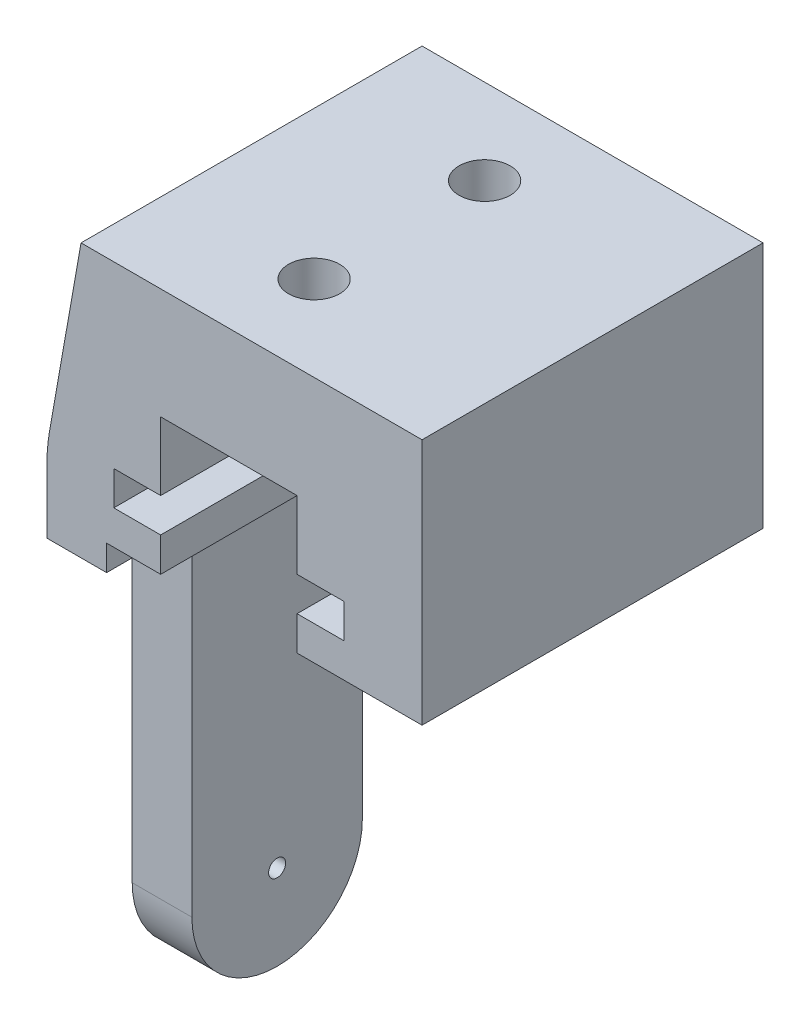
ISO-10303-21;
HEADER;
FILE_DESCRIPTION(('STEP AP214'),'2;1');
FILE_NAME('part.step','',(''),(''),'','','');
FILE_SCHEMA(('AUTOMOTIVE_DESIGN { 1 0 10303 214 1 1 1 1 }'));
ENDSEC;
DATA;
#1=APPLICATION_CONTEXT('core data for automotive mechanical design processes');
#2=APPLICATION_PROTOCOL_DEFINITION('international standard','automotive_design',2000,#1);
#3=PRODUCT_CONTEXT('',#1,'mechanical');
#4=PRODUCT('Part','Part','',(#3));
#5=PRODUCT_RELATED_PRODUCT_CATEGORY('part','',(#4));
#6=PRODUCT_DEFINITION_FORMATION('','',#4);
#7=PRODUCT_DEFINITION_CONTEXT('part definition',#1,'design');
#8=PRODUCT_DEFINITION('design','',#6,#7);
#9=PRODUCT_DEFINITION_SHAPE('','',#8);
#10=(LENGTH_UNIT() NAMED_UNIT(*) SI_UNIT(.MILLI.,.METRE.));
#11=(NAMED_UNIT(*) PLANE_ANGLE_UNIT() SI_UNIT($,.RADIAN.));
#12=(NAMED_UNIT(*) SI_UNIT($,.STERADIAN.) SOLID_ANGLE_UNIT());
#13=UNCERTAINTY_MEASURE_WITH_UNIT(LENGTH_MEASURE(1.E-05),#10,'distance_accuracy_value','');
#14=(GEOMETRIC_REPRESENTATION_CONTEXT(3) GLOBAL_UNCERTAINTY_ASSIGNED_CONTEXT((#13)) GLOBAL_UNIT_ASSIGNED_CONTEXT((#10,
#11,#12)) REPRESENTATION_CONTEXT('',''));
#15=CARTESIAN_POINT('',(0.,0.,0.));
#16=DIRECTION('',(0.,0.,1.));
#17=DIRECTION('',(1.,0.,0.));
#18=AXIS2_PLACEMENT_3D('',#15,#16,#17);
#19=CARTESIAN_POINT('',(0.,-16.,20.));
#20=DIRECTION('',(0.,1.,0.));
#21=DIRECTION('',(0.,0.,1.));
#22=AXIS2_PLACEMENT_3D('',#19,#20,#21);
#23=PLANE('',#22);
#24=DIRECTION('',(0.,0.,-1.));
#25=VECTOR('',#24,1.);
#26=CARTESIAN_POINT('',(0.,-16.,20.));
#27=LINE('',#26,#25);
#28=CARTESIAN_POINT('',(0.,-16.,20.));
#29=VERTEX_POINT('',#28);
#30=CARTESIAN_POINT('',(0.,-16.,16.));
#31=VERTEX_POINT('',#30);
#32=EDGE_CURVE('E348',#29,#31,#27,.T.);
#33=ORIENTED_EDGE('',*,*,#32,.T.);
#34=DIRECTION('',(-1.,0.,0.));
#35=VECTOR('',#34,1.);
#36=CARTESIAN_POINT('',(3.5,-16.,16.));
#37=LINE('',#36,#35);
#38=CARTESIAN_POINT('',(3.5,-16.,16.));
#39=VERTEX_POINT('',#38);
#40=EDGE_CURVE('E55',#31,#39,#37,.F.);
#41=ORIENTED_EDGE('',*,*,#40,.T.);
#42=DIRECTION('',(0.,0.,1.));
#43=VECTOR('',#42,1.);
#44=CARTESIAN_POINT('',(3.5,-16.,-20.7966343430854));
#45=LINE('',#44,#43);
#46=CARTESIAN_POINT('',(3.5,-16.,20.));
#47=VERTEX_POINT('',#46);
#48=EDGE_CURVE('E332',#39,#47,#45,.T.);
#49=ORIENTED_EDGE('',*,*,#48,.T.);
#50=DIRECTION('',(1.,0.,0.));
#51=VECTOR('',#50,1.);
#52=CARTESIAN_POINT('',(0.,-16.,20.));
#53=LINE('',#52,#51);
#54=EDGE_CURVE('E455',#29,#47,#53,.T.);
#55=ORIENTED_EDGE('',*,*,#54,.F.);
#56=EDGE_LOOP('',(#33,#41,#49,#55));
#57=FACE_BOUND('',#56,.T.);
#58=ADVANCED_FACE('F34',(#57),#23,.F.);
#59=CARTESIAN_POINT('',(3.5,-16.,0.));
#60=VERTEX_POINT('',#59);
#61=CARTESIAN_POINT('',(3.5,-16.,4.));
#62=VERTEX_POINT('',#61);
#63=EDGE_CURVE('E342',#60,#62,#45,.T.);
#64=ORIENTED_EDGE('',*,*,#63,.T.);
#65=DIRECTION('',(1.,0.,0.));
#66=VECTOR('',#65,1.);
#67=CARTESIAN_POINT('',(0.,-16.,4.));
#68=LINE('',#67,#66);
#69=CARTESIAN_POINT('',(0.,-16.,4.));
#70=VERTEX_POINT('',#69);
#71=EDGE_CURVE('E364',#62,#70,#68,.F.);
#72=ORIENTED_EDGE('',*,*,#71,.T.);
#73=CARTESIAN_POINT('',(0.,-16.,0.));
#74=VERTEX_POINT('',#73);
#75=EDGE_CURVE('E351',#70,#74,#27,.T.);
#76=ORIENTED_EDGE('',*,*,#75,.T.);
#77=DIRECTION('',(1.,0.,0.));
#78=VECTOR('',#77,1.);
#79=CARTESIAN_POINT('',(0.,-16.,0.));
#80=LINE('',#79,#78);
#81=EDGE_CURVE('E422',#74,#60,#80,.T.);
#82=ORIENTED_EDGE('',*,*,#81,.T.);
#83=EDGE_LOOP('',(#64,#72,#76,#82));
#84=FACE_BOUND('',#83,.T.);
#85=ADVANCED_FACE('F506',(#84),#23,.F.);
#86=CARTESIAN_POINT('',(22.,0.,20.));
#87=DIRECTION('',(-1.,0.,0.));
#88=DIRECTION('',(0.,-1.,0.));
#89=AXIS2_PLACEMENT_3D('',#86,#87,#88);
#90=PLANE('',#89);
#91=DIRECTION('',(0.,0.,1.));
#92=VECTOR('',#91,1.);
#93=CARTESIAN_POINT('',(22.,-14.5,-20.7966343430854));
#94=LINE('',#93,#92);
#95=CARTESIAN_POINT('',(22.,-14.5,0.));
#96=VERTEX_POINT('',#95);
#97=CARTESIAN_POINT('',(22.,-14.5,20.));
#98=VERTEX_POINT('',#97);
#99=EDGE_CURVE('E335',#96,#98,#94,.T.);
#100=ORIENTED_EDGE('',*,*,#99,.F.);
#101=DIRECTION('',(0.,1.,0.));
#102=VECTOR('',#101,1.);
#103=CARTESIAN_POINT('',(22.,0.,0.));
#104=LINE('',#103,#102);
#105=CARTESIAN_POINT('',(22.,0.,0.));
#106=VERTEX_POINT('',#105);
#107=EDGE_CURVE('E413',#96,#106,#104,.T.);
#108=ORIENTED_EDGE('',*,*,#107,.T.);
#109=DIRECTION('',(0.,0.,-1.));
#110=VECTOR('',#109,1.);
#111=CARTESIAN_POINT('',(22.,0.,20.));
#112=LINE('',#111,#110);
#113=CARTESIAN_POINT('',(22.,0.,20.));
#114=VERTEX_POINT('',#113);
#115=EDGE_CURVE('E356',#114,#106,#112,.T.);
#116=ORIENTED_EDGE('',*,*,#115,.F.);
#117=DIRECTION('',(0.,1.,0.));
#118=VECTOR('',#117,1.);
#119=CARTESIAN_POINT('',(22.,0.,20.));
#120=LINE('',#119,#118);
#121=EDGE_CURVE('E457',#98,#114,#120,.T.);
#122=ORIENTED_EDGE('',*,*,#121,.F.);
#123=EDGE_LOOP('',(#100,#108,#116,#122));
#124=FACE_BOUND('',#123,.T.);
#125=ADVANCED_FACE('F430',(#124),#90,.F.);
#126=CARTESIAN_POINT('',(0.,0.,20.));
#127=DIRECTION('',(0.,0.,1.));
#128=DIRECTION('',(1.,0.,0.));
#129=AXIS2_PLACEMENT_3D('',#126,#127,#128);
#130=PLANE('',#129);
#131=DIRECTION('',(0.173648177666931,0.984807753012208,0.));
#132=VECTOR('',#131,1.);
#133=CARTESIAN_POINT('',(1.93969262078591,-0.34202014332567,20.));
#134=LINE('',#133,#132);
#135=CARTESIAN_POINT('',(2.,0.,20.));
#136=VERTEX_POINT('',#135);
#137=CARTESIAN_POINT('',(0.151922469877919,-10.4809684978253,20.));
#138=VERTEX_POINT('',#137);
#139=EDGE_CURVE('E396',#136,#138,#134,.F.);
#140=ORIENTED_EDGE('',*,*,#139,.T.);
#141=CARTESIAN_POINT('',(10.,-12.2174502744946,20.));
#142=DIRECTION('',(0.,0.,1.));
#143=DIRECTION('',(1.,0.,0.));
#144=AXIS2_PLACEMENT_3D('',#141,#142,#143);
#145=CIRCLE('',#144,10.);
#146=CARTESIAN_POINT('',(0.,-12.2174502744946,20.));
#147=VERTEX_POINT('',#146);
#148=EDGE_CURVE('E346',#138,#147,#145,.T.);
#149=ORIENTED_EDGE('',*,*,#148,.T.);
#150=DIRECTION('',(0.,-1.,0.));
#151=VECTOR('',#150,1.);
#152=CARTESIAN_POINT('',(0.,0.,20.));
#153=LINE('',#152,#151);
#154=EDGE_CURVE('E412',#147,#29,#153,.T.);
#155=ORIENTED_EDGE('',*,*,#154,.T.);
#156=ORIENTED_EDGE('',*,*,#54,.T.);
#157=DIRECTION('',(0.,1.,0.));
#158=VECTOR('',#157,1.);
#159=CARTESIAN_POINT('',(3.5,-16.,20.));
#160=LINE('',#159,#158);
#161=CARTESIAN_POINT('',(3.5,-14.5,20.));
#162=VERTEX_POINT('',#161);
#163=EDGE_CURVE('E302',#47,#162,#160,.T.);
#164=ORIENTED_EDGE('',*,*,#163,.T.);
#165=DIRECTION('',(1.,0.,0.));
#166=VECTOR('',#165,1.);
#167=CARTESIAN_POINT('',(3.5,-14.5,20.));
#168=LINE('',#167,#166);
#169=CARTESIAN_POINT('',(6.67,-14.5,20.));
#170=VERTEX_POINT('',#169);
#171=EDGE_CURVE('E305',#162,#170,#168,.T.);
#172=ORIENTED_EDGE('',*,*,#171,.T.);
#173=DIRECTION('',(0.,1.,0.));
#174=VECTOR('',#173,1.);
#175=CARTESIAN_POINT('',(6.67,-14.5,20.));
#176=LINE('',#175,#174);
#177=CARTESIAN_POINT('',(6.67,-12.5,20.));
#178=VERTEX_POINT('',#177);
#179=EDGE_CURVE('E308',#170,#178,#176,.T.);
#180=ORIENTED_EDGE('',*,*,#179,.T.);
#181=DIRECTION('',(-1.,0.,0.));
#182=VECTOR('',#181,1.);
#183=CARTESIAN_POINT('',(6.67,-12.5,20.));
#184=LINE('',#183,#182);
#185=CARTESIAN_POINT('',(3.92,-12.5,20.));
#186=VERTEX_POINT('',#185);
#187=EDGE_CURVE('E311',#178,#186,#184,.T.);
#188=ORIENTED_EDGE('',*,*,#187,.T.);
#189=DIRECTION('',(0.,1.,0.));
#190=VECTOR('',#189,1.);
#191=CARTESIAN_POINT('',(3.92,-12.5,20.));
#192=LINE('',#191,#190);
#193=CARTESIAN_POINT('',(3.92,-10.5,20.));
#194=VERTEX_POINT('',#193);
#195=EDGE_CURVE('E314',#186,#194,#192,.T.);
#196=ORIENTED_EDGE('',*,*,#195,.T.);
#197=DIRECTION('',(1.,0.,0.));
#198=VECTOR('',#197,1.);
#199=CARTESIAN_POINT('',(3.92,-10.5,20.));
#200=LINE('',#199,#198);
#201=CARTESIAN_POINT('',(6.67,-10.5,20.));
#202=VERTEX_POINT('',#201);
#203=EDGE_CURVE('E317',#194,#202,#200,.T.);
#204=ORIENTED_EDGE('',*,*,#203,.T.);
#205=DIRECTION('',(0.,1.,0.));
#206=VECTOR('',#205,1.);
#207=CARTESIAN_POINT('',(6.67,-10.5,20.));
#208=LINE('',#207,#206);
#209=CARTESIAN_POINT('',(6.67,-6.5,20.));
#210=VERTEX_POINT('',#209);
#211=EDGE_CURVE('E278',#202,#210,#208,.T.);
#212=ORIENTED_EDGE('',*,*,#211,.T.);
#213=DIRECTION('',(1.,0.,0.));
#214=VECTOR('',#213,1.);
#215=CARTESIAN_POINT('',(6.67,-6.5,20.));
#216=LINE('',#215,#214);
#217=CARTESIAN_POINT('',(14.67,-6.5,20.));
#218=VERTEX_POINT('',#217);
#219=EDGE_CURVE('E281',#210,#218,#216,.T.);
#220=ORIENTED_EDGE('',*,*,#219,.T.);
#221=DIRECTION('',(0.,-1.,0.));
#222=VECTOR('',#221,1.);
#223=CARTESIAN_POINT('',(14.67,-6.5,20.));
#224=LINE('',#223,#222);
#225=CARTESIAN_POINT('',(14.67,-10.5,20.));
#226=VERTEX_POINT('',#225);
#227=EDGE_CURVE('E284',#218,#226,#224,.T.);
#228=ORIENTED_EDGE('',*,*,#227,.T.);
#229=DIRECTION('',(1.,0.,0.));
#230=VECTOR('',#229,1.);
#231=CARTESIAN_POINT('',(14.67,-10.5,20.));
#232=LINE('',#231,#230);
#233=CARTESIAN_POINT('',(17.42,-10.5,20.));
#234=VERTEX_POINT('',#233);
#235=EDGE_CURVE('E287',#226,#234,#232,.T.);
#236=ORIENTED_EDGE('',*,*,#235,.T.);
#237=DIRECTION('',(0.,-1.,0.));
#238=VECTOR('',#237,1.);
#239=CARTESIAN_POINT('',(17.42,-10.5,20.));
#240=LINE('',#239,#238);
#241=CARTESIAN_POINT('',(17.42,-12.5,20.));
#242=VERTEX_POINT('',#241);
#243=EDGE_CURVE('E290',#234,#242,#240,.T.);
#244=ORIENTED_EDGE('',*,*,#243,.T.);
#245=DIRECTION('',(-1.,0.,0.));
#246=VECTOR('',#245,1.);
#247=CARTESIAN_POINT('',(17.42,-12.5,20.));
#248=LINE('',#247,#246);
#249=CARTESIAN_POINT('',(14.67,-12.5,20.));
#250=VERTEX_POINT('',#249);
#251=EDGE_CURVE('E293',#242,#250,#248,.T.);
#252=ORIENTED_EDGE('',*,*,#251,.T.);
#253=DIRECTION('',(0.,-1.,0.));
#254=VECTOR('',#253,1.);
#255=CARTESIAN_POINT('',(14.67,-12.5,20.));
#256=LINE('',#255,#254);
#257=CARTESIAN_POINT('',(14.67,-14.5,20.));
#258=VERTEX_POINT('',#257);
#259=EDGE_CURVE('E296',#250,#258,#256,.T.);
#260=ORIENTED_EDGE('',*,*,#259,.T.);
#261=DIRECTION('',(1.,0.,0.));
#262=VECTOR('',#261,1.);
#263=CARTESIAN_POINT('',(14.67,-14.5,20.));
#264=LINE('',#263,#262);
#265=EDGE_CURVE('E299',#258,#98,#264,.T.);
#266=ORIENTED_EDGE('',*,*,#265,.T.);
#267=ORIENTED_EDGE('',*,*,#121,.T.);
#268=DIRECTION('',(-1.,0.,0.));
#269=VECTOR('',#268,1.);
#270=CARTESIAN_POINT('',(0.,0.,20.));
#271=LINE('',#270,#269);
#272=EDGE_CURVE('E416',#114,#136,#271,.T.);
#273=ORIENTED_EDGE('',*,*,#272,.T.);
#274=EDGE_LOOP('',(#140,#149,#155,#156,#164,#172,#180,#188,#196,#204,#212,#220,#228,#236,#244,
#252,#260,#266,#267,#273));
#275=FACE_BOUND('',#274,.T.);
#276=ADVANCED_FACE('F415',(#275),#130,.T.);
#277=CARTESIAN_POINT('',(0.,0.,0.));
#278=DIRECTION('',(0.,0.,1.));
#279=DIRECTION('',(1.,0.,0.));
#280=AXIS2_PLACEMENT_3D('',#277,#278,#279);
#281=PLANE('',#280);
#282=DIRECTION('',(0.,-1.,0.));
#283=VECTOR('',#282,1.);
#284=CARTESIAN_POINT('',(0.,0.,0.));
#285=LINE('',#284,#283);
#286=CARTESIAN_POINT('',(0.,-12.2174502744946,0.));
#287=VERTEX_POINT('',#286);
#288=EDGE_CURVE('E277',#287,#74,#285,.T.);
#289=ORIENTED_EDGE('',*,*,#288,.F.);
#290=CARTESIAN_POINT('',(10.,-12.2174502744946,0.));
#291=DIRECTION('',(0.,0.,1.));
#292=DIRECTION('',(1.,0.,0.));
#293=AXIS2_PLACEMENT_3D('',#290,#291,#292);
#294=CIRCLE('',#293,10.);
#295=CARTESIAN_POINT('',(0.151922469877919,-10.4809684978253,0.));
#296=VERTEX_POINT('',#295);
#297=EDGE_CURVE('E386',#287,#296,#294,.F.);
#298=ORIENTED_EDGE('',*,*,#297,.T.);
#299=DIRECTION('',(-0.173648177666931,-0.984807753012208,0.));
#300=VECTOR('',#299,1.);
#301=CARTESIAN_POINT('',(0.,-11.3425636392354,0.));
#302=LINE('',#301,#300);
#303=CARTESIAN_POINT('',(2.,0.,0.));
#304=VERTEX_POINT('',#303);
#305=EDGE_CURVE('E350',#296,#304,#302,.F.);
#306=ORIENTED_EDGE('',*,*,#305,.T.);
#307=DIRECTION('',(-1.,0.,0.));
#308=VECTOR('',#307,1.);
#309=CARTESIAN_POINT('',(0.,0.,0.));
#310=LINE('',#309,#308);
#311=EDGE_CURVE('E408',#106,#304,#310,.T.);
#312=ORIENTED_EDGE('',*,*,#311,.F.);
#313=ORIENTED_EDGE('',*,*,#107,.F.);
#314=DIRECTION('',(-1.,0.,0.));
#315=VECTOR('',#314,1.);
#316=CARTESIAN_POINT('',(14.67,-14.5,0.));
#317=LINE('',#316,#315);
#318=CARTESIAN_POINT('',(14.67,-14.5,0.));
#319=VERTEX_POINT('',#318);
#320=EDGE_CURVE('E253',#96,#319,#317,.T.);
#321=ORIENTED_EDGE('',*,*,#320,.T.);
#322=DIRECTION('',(0.,1.,0.));
#323=VECTOR('',#322,1.);
#324=CARTESIAN_POINT('',(14.67,-12.5,0.));
#325=LINE('',#324,#323);
#326=CARTESIAN_POINT('',(14.67,-12.5,0.));
#327=VERTEX_POINT('',#326);
#328=EDGE_CURVE('E256',#319,#327,#325,.T.);
#329=ORIENTED_EDGE('',*,*,#328,.T.);
#330=DIRECTION('',(1.,0.,0.));
#331=VECTOR('',#330,1.);
#332=CARTESIAN_POINT('',(17.42,-12.5,0.));
#333=LINE('',#332,#331);
#334=CARTESIAN_POINT('',(17.42,-12.5,0.));
#335=VERTEX_POINT('',#334);
#336=EDGE_CURVE('E259',#327,#335,#333,.T.);
#337=ORIENTED_EDGE('',*,*,#336,.T.);
#338=DIRECTION('',(0.,1.,0.));
#339=VECTOR('',#338,1.);
#340=CARTESIAN_POINT('',(17.42,-10.5,0.));
#341=LINE('',#340,#339);
#342=CARTESIAN_POINT('',(17.42,-10.5,0.));
#343=VERTEX_POINT('',#342);
#344=EDGE_CURVE('E262',#335,#343,#341,.T.);
#345=ORIENTED_EDGE('',*,*,#344,.T.);
#346=DIRECTION('',(-1.,0.,0.));
#347=VECTOR('',#346,1.);
#348=CARTESIAN_POINT('',(14.67,-10.5,0.));
#349=LINE('',#348,#347);
#350=CARTESIAN_POINT('',(14.67,-10.5,0.));
#351=VERTEX_POINT('',#350);
#352=EDGE_CURVE('E265',#343,#351,#349,.T.);
#353=ORIENTED_EDGE('',*,*,#352,.T.);
#354=DIRECTION('',(0.,1.,0.));
#355=VECTOR('',#354,1.);
#356=CARTESIAN_POINT('',(14.67,-6.5,0.));
#357=LINE('',#356,#355);
#358=CARTESIAN_POINT('',(14.67,-6.5,0.));
#359=VERTEX_POINT('',#358);
#360=EDGE_CURVE('E268',#351,#359,#357,.T.);
#361=ORIENTED_EDGE('',*,*,#360,.T.);
#362=DIRECTION('',(-1.,0.,0.));
#363=VECTOR('',#362,1.);
#364=CARTESIAN_POINT('',(6.67,-6.5,0.));
#365=LINE('',#364,#363);
#366=CARTESIAN_POINT('',(6.67,-6.5,0.));
#367=VERTEX_POINT('',#366);
#368=EDGE_CURVE('E271',#359,#367,#365,.T.);
#369=ORIENTED_EDGE('',*,*,#368,.T.);
#370=DIRECTION('',(0.,-1.,0.));
#371=VECTOR('',#370,1.);
#372=CARTESIAN_POINT('',(6.67,-10.5,0.));
#373=LINE('',#372,#371);
#374=CARTESIAN_POINT('',(6.67,-10.5,0.));
#375=VERTEX_POINT('',#374);
#376=EDGE_CURVE('E274',#367,#375,#373,.T.);
#377=ORIENTED_EDGE('',*,*,#376,.T.);
#378=DIRECTION('',(-1.,0.,0.));
#379=VECTOR('',#378,1.);
#380=CARTESIAN_POINT('',(3.92,-10.5,0.));
#381=LINE('',#380,#379);
#382=CARTESIAN_POINT('',(3.92,-10.5,0.));
#383=VERTEX_POINT('',#382);
#384=EDGE_CURVE('E241',#375,#383,#381,.T.);
#385=ORIENTED_EDGE('',*,*,#384,.T.);
#386=DIRECTION('',(0.,-1.,0.));
#387=VECTOR('',#386,1.);
#388=CARTESIAN_POINT('',(3.92,-12.5,0.));
#389=LINE('',#388,#387);
#390=CARTESIAN_POINT('',(3.92,-12.5,0.));
#391=VERTEX_POINT('',#390);
#392=EDGE_CURVE('E237',#383,#391,#389,.T.);
#393=ORIENTED_EDGE('',*,*,#392,.T.);
#394=DIRECTION('',(1.,0.,0.));
#395=VECTOR('',#394,1.);
#396=CARTESIAN_POINT('',(6.67,-12.5,0.));
#397=LINE('',#396,#395);
#398=CARTESIAN_POINT('',(6.67,-12.5,0.));
#399=VERTEX_POINT('',#398);
#400=EDGE_CURVE('E240',#391,#399,#397,.T.);
#401=ORIENTED_EDGE('',*,*,#400,.T.);
#402=DIRECTION('',(0.,-1.,0.));
#403=VECTOR('',#402,1.);
#404=CARTESIAN_POINT('',(6.67,-14.5,0.));
#405=LINE('',#404,#403);
#406=CARTESIAN_POINT('',(6.67,-14.5,0.));
#407=VERTEX_POINT('',#406);
#408=EDGE_CURVE('E244',#399,#407,#405,.T.);
#409=ORIENTED_EDGE('',*,*,#408,.T.);
#410=DIRECTION('',(-1.,0.,0.));
#411=VECTOR('',#410,1.);
#412=CARTESIAN_POINT('',(3.5,-14.5,0.));
#413=LINE('',#412,#411);
#414=CARTESIAN_POINT('',(3.5,-14.5,0.));
#415=VERTEX_POINT('',#414);
#416=EDGE_CURVE('E247',#407,#415,#413,.T.);
#417=ORIENTED_EDGE('',*,*,#416,.T.);
#418=DIRECTION('',(0.,-1.,0.));
#419=VECTOR('',#418,1.);
#420=CARTESIAN_POINT('',(3.5,-16.,0.));
#421=LINE('',#420,#419);
#422=EDGE_CURVE('E250',#415,#60,#421,.T.);
#423=ORIENTED_EDGE('',*,*,#422,.T.);
#424=ORIENTED_EDGE('',*,*,#81,.F.);
#425=EDGE_LOOP('',(#289,#298,#306,#312,#313,#321,#329,#337,#345,#353,#361,#369,#377,#385,#393,
#401,#409,#417,#423,#424));
#426=FACE_BOUND('',#425,.T.);
#427=ADVANCED_FACE('F406',(#426),#281,.F.);
#428=CARTESIAN_POINT('',(0.,0.,20.));
#429=DIRECTION('',(1.,0.,0.));
#430=DIRECTION('',(0.,1.,0.));
#431=AXIS2_PLACEMENT_3D('',#428,#429,#430);
#432=PLANE('',#431);
#433=CARTESIAN_POINT('',(0.,-36.,10.));
#434=DIRECTION('',(-1.,0.,0.));
#435=DIRECTION('',(0.,-1.,0.));
#436=AXIS2_PLACEMENT_3D('',#433,#434,#435);
#437=CIRCLE('',#436,0.500000000000001);
#438=CARTESIAN_POINT('',(0.,-36.5,10.));
#439=VERTEX_POINT('',#438);
#440=EDGE_CURVE('E582',#439,#439,#437,.T.);
#441=ORIENTED_EDGE('',*,*,#440,.F.);
#442=EDGE_LOOP('',(#441));
#443=FACE_BOUND('',#442,.T.);
#444=ORIENTED_EDGE('',*,*,#154,.F.);
#445=DIRECTION('',(0.,0.,1.));
#446=VECTOR('',#445,1.);
#447=CARTESIAN_POINT('',(0.,-12.2174502744946,0.));
#448=LINE('',#447,#446);
#449=EDGE_CURVE('E391',#147,#287,#448,.F.);
#450=ORIENTED_EDGE('',*,*,#449,.T.);
#451=ORIENTED_EDGE('',*,*,#288,.T.);
#452=ORIENTED_EDGE('',*,*,#75,.F.);
#453=CARTESIAN_POINT('',(0.,-17.,4.));
#454=DIRECTION('',(1.,0.,0.));
#455=DIRECTION('',(0.,1.,0.));
#456=AXIS2_PLACEMENT_3D('',#453,#454,#455);
#457=CIRCLE('',#456,1.);
#458=CARTESIAN_POINT('',(0.,-17.,5.));
#459=VERTEX_POINT('',#458);
#460=EDGE_CURVE('E370',#70,#459,#457,.T.);
#461=ORIENTED_EDGE('',*,*,#460,.T.);
#462=DIRECTION('',(0.,1.,0.));
#463=VECTOR('',#462,1.);
#464=CARTESIAN_POINT('',(0.,-36.,5.));
#465=LINE('',#464,#463);
#466=CARTESIAN_POINT('',(0.,-36.,5.));
#467=VERTEX_POINT('',#466);
#468=EDGE_CURVE('E216',#467,#459,#465,.T.);
#469=ORIENTED_EDGE('',*,*,#468,.F.);
#470=CARTESIAN_POINT('',(0.,-36.,10.));
#471=DIRECTION('',(-1.,0.,0.));
#472=DIRECTION('',(0.,1.,0.));
#473=AXIS2_PLACEMENT_3D('',#470,#471,#472);
#474=CIRCLE('',#473,5.);
#475=CARTESIAN_POINT('',(0.,-36.,15.));
#476=VERTEX_POINT('',#475);
#477=EDGE_CURVE('E226',#467,#476,#474,.T.);
#478=ORIENTED_EDGE('',*,*,#477,.T.);
#479=DIRECTION('',(0.,1.,0.));
#480=VECTOR('',#479,1.);
#481=CARTESIAN_POINT('',(0.,-36.,15.));
#482=LINE('',#481,#480);
#483=CARTESIAN_POINT('',(0.,-17.,15.));
#484=VERTEX_POINT('',#483);
#485=EDGE_CURVE('E233',#476,#484,#482,.T.);
#486=ORIENTED_EDGE('',*,*,#485,.T.);
#487=CARTESIAN_POINT('',(0.,-17.,16.));
#488=DIRECTION('',(1.,0.,0.));
#489=DIRECTION('',(0.,1.,0.));
#490=AXIS2_PLACEMENT_3D('',#487,#488,#489);
#491=CIRCLE('',#490,1.);
#492=EDGE_CURVE('E42',#484,#31,#491,.T.);
#493=ORIENTED_EDGE('',*,*,#492,.T.);
#494=ORIENTED_EDGE('',*,*,#32,.F.);
#495=EDGE_LOOP('',(#444,#450,#451,#452,#461,#469,#478,#486,#493,#494));
#496=FACE_BOUND('',#495,.T.);
#497=ADVANCED_FACE('F376',(#443,#496),#432,.F.);
#498=CARTESIAN_POINT('',(0.,0.,20.));
#499=DIRECTION('',(0.,-1.,0.));
#500=DIRECTION('',(0.,0.,-1.));
#501=AXIS2_PLACEMENT_3D('',#498,#499,#500);
#502=PLANE('',#501);
#503=CARTESIAN_POINT('',(10.67,0.,5.));
#504=DIRECTION('',(0.,-1.,0.));
#505=DIRECTION('',(0.,0.,-1.));
#506=AXIS2_PLACEMENT_3D('',#503,#504,#505);
#507=CIRCLE('',#506,1.5);
#508=CARTESIAN_POINT('',(10.67,0.,3.5));
#509=VERTEX_POINT('',#508);
#510=EDGE_CURVE('E577',#509,#509,#507,.F.);
#511=ORIENTED_EDGE('',*,*,#510,.F.);
#512=EDGE_LOOP('',(#511));
#513=FACE_BOUND('',#512,.T.);
#514=CARTESIAN_POINT('',(10.67,0.,15.));
#515=DIRECTION('',(0.,-1.,0.));
#516=DIRECTION('',(0.,0.,-1.));
#517=AXIS2_PLACEMENT_3D('',#514,#515,#516);
#518=CIRCLE('',#517,1.5);
#519=CARTESIAN_POINT('',(10.67,0.,13.5));
#520=VERTEX_POINT('',#519);
#521=EDGE_CURVE('E580',#520,#520,#518,.F.);
#522=ORIENTED_EDGE('',*,*,#521,.F.);
#523=EDGE_LOOP('',(#522));
#524=FACE_BOUND('',#523,.T.);
#525=ORIENTED_EDGE('',*,*,#311,.T.);
#526=DIRECTION('',(0.,0.,1.));
#527=VECTOR('',#526,1.);
#528=CARTESIAN_POINT('',(2.,0.,20.));
#529=LINE('',#528,#527);
#530=EDGE_CURVE('E397',#304,#136,#529,.T.);
#531=ORIENTED_EDGE('',*,*,#530,.T.);
#532=ORIENTED_EDGE('',*,*,#272,.F.);
#533=ORIENTED_EDGE('',*,*,#115,.T.);
#534=EDGE_LOOP('',(#525,#531,#532,#533));
#535=FACE_BOUND('',#534,.T.);
#536=ADVANCED_FACE('F410',(#513,#524,#535),#502,.F.);
#537=CARTESIAN_POINT('',(0.,-11.3425636392354,20.));
#538=DIRECTION('',(0.984807753012208,-0.173648177666931,0.));
#539=DIRECTION('',(0.,0.,-1.));
#540=AXIS2_PLACEMENT_3D('',#537,#538,#539);
#541=PLANE('',#540);
#542=ORIENTED_EDGE('',*,*,#305,.F.);
#543=DIRECTION('',(0.,0.,-1.));
#544=VECTOR('',#543,1.);
#545=CARTESIAN_POINT('',(0.151922469877919,-10.4809684978253,20.));
#546=LINE('',#545,#544);
#547=EDGE_CURVE('E382',#296,#138,#546,.F.);
#548=ORIENTED_EDGE('',*,*,#547,.T.);
#549=ORIENTED_EDGE('',*,*,#139,.F.);
#550=ORIENTED_EDGE('',*,*,#530,.F.);
#551=EDGE_LOOP('',(#542,#548,#549,#550));
#552=FACE_BOUND('',#551,.T.);
#553=ADVANCED_FACE('F414',(#552),#541,.F.);
#554=CARTESIAN_POINT('',(3.92,-10.5,-20.7966343430854));
#555=DIRECTION('',(0.,-1.,0.));
#556=DIRECTION('',(1.,0.,0.));
#557=AXIS2_PLACEMENT_3D('',#554,#555,#556);
#558=PLANE('',#557);
#559=DIRECTION('',(0.,0.,1.));
#560=VECTOR('',#559,1.);
#561=CARTESIAN_POINT('',(6.67,-10.5,-20.7966343430854));
#562=LINE('',#561,#560);
#563=EDGE_CURVE('E320',#375,#202,#562,.T.);
#564=ORIENTED_EDGE('',*,*,#563,.T.);
#565=ORIENTED_EDGE('',*,*,#203,.F.);
#566=DIRECTION('',(0.,0.,1.));
#567=VECTOR('',#566,1.);
#568=CARTESIAN_POINT('',(3.92,-10.5,-20.7966343430854));
#569=LINE('',#568,#567);
#570=EDGE_CURVE('E322',#383,#194,#569,.T.);
#571=ORIENTED_EDGE('',*,*,#570,.F.);
#572=ORIENTED_EDGE('',*,*,#384,.F.);
#573=EDGE_LOOP('',(#564,#565,#571,#572));
#574=FACE_BOUND('',#573,.T.);
#575=ADVANCED_FACE('F487',(#574),#558,.T.);
#576=CARTESIAN_POINT('',(3.92,-12.5,-20.7966343430854));
#577=DIRECTION('',(1.,0.,0.));
#578=DIRECTION('',(0.,0.,-1.));
#579=AXIS2_PLACEMENT_3D('',#576,#577,#578);
#580=PLANE('',#579);
#581=ORIENTED_EDGE('',*,*,#570,.T.);
#582=ORIENTED_EDGE('',*,*,#195,.F.);
#583=DIRECTION('',(0.,0.,1.));
#584=VECTOR('',#583,1.);
#585=CARTESIAN_POINT('',(3.92,-12.5,-20.7966343430854));
#586=LINE('',#585,#584);
#587=EDGE_CURVE('E324',#391,#186,#586,.T.);
#588=ORIENTED_EDGE('',*,*,#587,.F.);
#589=ORIENTED_EDGE('',*,*,#392,.F.);
#590=EDGE_LOOP('',(#581,#582,#588,#589));
#591=FACE_BOUND('',#590,.T.);
#592=ADVANCED_FACE('F490',(#591),#580,.T.);
#593=CARTESIAN_POINT('',(6.67,-12.5,-20.7966343430854));
#594=DIRECTION('',(0.,1.,0.));
#595=DIRECTION('',(-1.,0.,0.));
#596=AXIS2_PLACEMENT_3D('',#593,#594,#595);
#597=PLANE('',#596);
#598=ORIENTED_EDGE('',*,*,#587,.T.);
#599=ORIENTED_EDGE('',*,*,#187,.F.);
#600=DIRECTION('',(0.,0.,1.));
#601=VECTOR('',#600,1.);
#602=CARTESIAN_POINT('',(6.67,-12.5,-20.7966343430854));
#603=LINE('',#602,#601);
#604=EDGE_CURVE('E326',#399,#178,#603,.T.);
#605=ORIENTED_EDGE('',*,*,#604,.F.);
#606=ORIENTED_EDGE('',*,*,#400,.F.);
#607=EDGE_LOOP('',(#598,#599,#605,#606));
#608=FACE_BOUND('',#607,.T.);
#609=ADVANCED_FACE('F494',(#608),#597,.T.);
#610=CARTESIAN_POINT('',(6.67,-14.5,-20.7966343430854));
#611=DIRECTION('',(1.,0.,0.));
#612=DIRECTION('',(0.,0.,-1.));
#613=AXIS2_PLACEMENT_3D('',#610,#611,#612);
#614=PLANE('',#613);
#615=ORIENTED_EDGE('',*,*,#604,.T.);
#616=ORIENTED_EDGE('',*,*,#179,.F.);
#617=DIRECTION('',(0.,0.,1.));
#618=VECTOR('',#617,1.);
#619=CARTESIAN_POINT('',(6.67,-14.5,-20.7966343430854));
#620=LINE('',#619,#618);
#621=EDGE_CURVE('E328',#407,#170,#620,.T.);
#622=ORIENTED_EDGE('',*,*,#621,.F.);
#623=ORIENTED_EDGE('',*,*,#408,.F.);
#624=EDGE_LOOP('',(#615,#616,#622,#623));
#625=FACE_BOUND('',#624,.T.);
#626=ADVANCED_FACE('F498',(#625),#614,.T.);
#627=CARTESIAN_POINT('',(3.5,-14.5,-20.7966343430854));
#628=DIRECTION('',(0.,-1.,0.));
#629=DIRECTION('',(0.,0.,-1.));
#630=AXIS2_PLACEMENT_3D('',#627,#628,#629);
#631=PLANE('',#630);
#632=ORIENTED_EDGE('',*,*,#621,.T.);
#633=ORIENTED_EDGE('',*,*,#171,.F.);
#634=DIRECTION('',(0.,0.,1.));
#635=VECTOR('',#634,1.);
#636=CARTESIAN_POINT('',(3.5,-14.5,-20.7966343430854));
#637=LINE('',#636,#635);
#638=EDGE_CURVE('E330',#415,#162,#637,.T.);
#639=ORIENTED_EDGE('',*,*,#638,.F.);
#640=ORIENTED_EDGE('',*,*,#416,.F.);
#641=EDGE_LOOP('',(#632,#633,#639,#640));
#642=FACE_BOUND('',#641,.T.);
#643=ADVANCED_FACE('F502',(#642),#631,.T.);
#644=CARTESIAN_POINT('',(3.5,-16.,-20.7966343430854));
#645=DIRECTION('',(1.,0.,0.));
#646=DIRECTION('',(0.,0.,-1.));
#647=AXIS2_PLACEMENT_3D('',#644,#645,#646);
#648=PLANE('',#647);
#649=CARTESIAN_POINT('',(3.5,-36.,10.));
#650=DIRECTION('',(1.,0.,0.));
#651=DIRECTION('',(0.,0.,-1.));
#652=AXIS2_PLACEMENT_3D('',#649,#650,#651);
#653=CIRCLE('',#652,0.500000000000001);
#654=CARTESIAN_POINT('',(3.5,-36.,9.5));
#655=VERTEX_POINT('',#654);
#656=EDGE_CURVE('E586',#655,#655,#653,.F.);
#657=ORIENTED_EDGE('',*,*,#656,.T.);
#658=EDGE_LOOP('',(#657));
#659=FACE_BOUND('',#658,.T.);
#660=ORIENTED_EDGE('',*,*,#638,.T.);
#661=ORIENTED_EDGE('',*,*,#163,.F.);
#662=ORIENTED_EDGE('',*,*,#48,.F.);
#663=CARTESIAN_POINT('',(3.5,-17.,16.));
#664=DIRECTION('',(1.,0.,0.));
#665=DIRECTION('',(0.,0.,-1.));
#666=AXIS2_PLACEMENT_3D('',#663,#664,#665);
#667=CIRCLE('',#666,1.);
#668=CARTESIAN_POINT('',(3.5,-17.,15.));
#669=VERTEX_POINT('',#668);
#670=EDGE_CURVE('E11',#39,#669,#667,.F.);
#671=ORIENTED_EDGE('',*,*,#670,.T.);
#672=DIRECTION('',(0.,1.,0.));
#673=VECTOR('',#672,1.);
#674=CARTESIAN_POINT('',(3.5,-36.,15.));
#675=LINE('',#674,#673);
#676=CARTESIAN_POINT('',(3.5,-36.,15.));
#677=VERTEX_POINT('',#676);
#678=EDGE_CURVE('E217',#677,#669,#675,.T.);
#679=ORIENTED_EDGE('',*,*,#678,.F.);
#680=CARTESIAN_POINT('',(3.5,-36.,10.));
#681=DIRECTION('',(1.,0.,0.));
#682=DIRECTION('',(0.,0.,-1.));
#683=AXIS2_PLACEMENT_3D('',#680,#681,#682);
#684=CIRCLE('',#683,5.);
#685=CARTESIAN_POINT('',(3.50000000000001,-36.,5.));
#686=VERTEX_POINT('',#685);
#687=EDGE_CURVE('E220',#686,#677,#684,.F.);
#688=ORIENTED_EDGE('',*,*,#687,.F.);
#689=DIRECTION('',(0.,1.,0.));
#690=VECTOR('',#689,1.);
#691=CARTESIAN_POINT('',(3.5,-36.,5.));
#692=LINE('',#691,#690);
#693=CARTESIAN_POINT('',(3.5,-17.,5.));
#694=VERTEX_POINT('',#693);
#695=EDGE_CURVE('E206',#686,#694,#692,.T.);
#696=ORIENTED_EDGE('',*,*,#695,.T.);
#697=CARTESIAN_POINT('',(3.5,-17.,4.));
#698=DIRECTION('',(1.,0.,0.));
#699=DIRECTION('',(0.,0.,-1.));
#700=AXIS2_PLACEMENT_3D('',#697,#698,#699);
#701=CIRCLE('',#700,1.);
#702=EDGE_CURVE('E369',#694,#62,#701,.F.);
#703=ORIENTED_EDGE('',*,*,#702,.T.);
#704=ORIENTED_EDGE('',*,*,#63,.F.);
#705=ORIENTED_EDGE('',*,*,#422,.F.);
#706=EDGE_LOOP('',(#660,#661,#662,#671,#679,#688,#696,#703,#704,#705));
#707=FACE_BOUND('',#706,.T.);
#708=ADVANCED_FACE('F221',(#659,#707),#648,.T.);
#709=CARTESIAN_POINT('',(14.67,-14.5,-20.7966343430854));
#710=DIRECTION('',(0.,-1.,0.));
#711=DIRECTION('',(0.,0.,-1.));
#712=AXIS2_PLACEMENT_3D('',#709,#710,#711);
#713=PLANE('',#712);
#714=ORIENTED_EDGE('',*,*,#99,.T.);
#715=ORIENTED_EDGE('',*,*,#265,.F.);
#716=DIRECTION('',(0.,0.,1.));
#717=VECTOR('',#716,1.);
#718=CARTESIAN_POINT('',(14.67,-14.5,-20.7966343430854));
#719=LINE('',#718,#717);
#720=EDGE_CURVE('E436',#319,#258,#719,.T.);
#721=ORIENTED_EDGE('',*,*,#720,.F.);
#722=ORIENTED_EDGE('',*,*,#320,.F.);
#723=EDGE_LOOP('',(#714,#715,#721,#722));
#724=FACE_BOUND('',#723,.T.);
#725=ADVANCED_FACE('F434',(#724),#713,.T.);
#726=CARTESIAN_POINT('',(14.67,-12.5,-20.7966343430854));
#727=DIRECTION('',(-1.,0.,0.));
#728=DIRECTION('',(0.,0.,1.));
#729=AXIS2_PLACEMENT_3D('',#726,#727,#728);
#730=PLANE('',#729);
#731=ORIENTED_EDGE('',*,*,#720,.T.);
#732=ORIENTED_EDGE('',*,*,#259,.F.);
#733=DIRECTION('',(0.,0.,1.));
#734=VECTOR('',#733,1.);
#735=CARTESIAN_POINT('',(14.67,-12.5,-20.7966343430854));
#736=LINE('',#735,#734);
#737=EDGE_CURVE('E439',#327,#250,#736,.T.);
#738=ORIENTED_EDGE('',*,*,#737,.F.);
#739=ORIENTED_EDGE('',*,*,#328,.F.);
#740=EDGE_LOOP('',(#731,#732,#738,#739));
#741=FACE_BOUND('',#740,.T.);
#742=ADVANCED_FACE('F460',(#741),#730,.T.);
#743=CARTESIAN_POINT('',(17.42,-12.5,-20.7966343430854));
#744=DIRECTION('',(0.,1.,0.));
#745=DIRECTION('',(0.,0.,1.));
#746=AXIS2_PLACEMENT_3D('',#743,#744,#745);
#747=PLANE('',#746);
#748=ORIENTED_EDGE('',*,*,#737,.T.);
#749=ORIENTED_EDGE('',*,*,#251,.F.);
#750=DIRECTION('',(0.,0.,1.));
#751=VECTOR('',#750,1.);
#752=CARTESIAN_POINT('',(17.42,-12.5,-20.7966343430854));
#753=LINE('',#752,#751);
#754=EDGE_CURVE('E440',#335,#242,#753,.T.);
#755=ORIENTED_EDGE('',*,*,#754,.F.);
#756=ORIENTED_EDGE('',*,*,#336,.F.);
#757=EDGE_LOOP('',(#748,#749,#755,#756));
#758=FACE_BOUND('',#757,.T.);
#759=ADVANCED_FACE('F462',(#758),#747,.T.);
#760=CARTESIAN_POINT('',(17.42,-10.5,-20.7966343430854));
#761=DIRECTION('',(-1.,0.,0.));
#762=DIRECTION('',(0.,0.,1.));
#763=AXIS2_PLACEMENT_3D('',#760,#761,#762);
#764=PLANE('',#763);
#765=ORIENTED_EDGE('',*,*,#754,.T.);
#766=ORIENTED_EDGE('',*,*,#243,.F.);
#767=DIRECTION('',(0.,0.,1.));
#768=VECTOR('',#767,1.);
#769=CARTESIAN_POINT('',(17.42,-10.5,-20.7966343430854));
#770=LINE('',#769,#768);
#771=EDGE_CURVE('E444',#343,#234,#770,.T.);
#772=ORIENTED_EDGE('',*,*,#771,.F.);
#773=ORIENTED_EDGE('',*,*,#344,.F.);
#774=EDGE_LOOP('',(#765,#766,#772,#773));
#775=FACE_BOUND('',#774,.T.);
#776=ADVANCED_FACE('F466',(#775),#764,.T.);
#777=CARTESIAN_POINT('',(14.67,-10.5,-20.7966343430854));
#778=DIRECTION('',(0.,-1.,0.));
#779=DIRECTION('',(0.,0.,-1.));
#780=AXIS2_PLACEMENT_3D('',#777,#778,#779);
#781=PLANE('',#780);
#782=ORIENTED_EDGE('',*,*,#771,.T.);
#783=ORIENTED_EDGE('',*,*,#235,.F.);
#784=DIRECTION('',(0.,0.,1.));
#785=VECTOR('',#784,1.);
#786=CARTESIAN_POINT('',(14.67,-10.5,-20.7966343430854));
#787=LINE('',#786,#785);
#788=EDGE_CURVE('E446',#351,#226,#787,.T.);
#789=ORIENTED_EDGE('',*,*,#788,.F.);
#790=ORIENTED_EDGE('',*,*,#352,.F.);
#791=EDGE_LOOP('',(#782,#783,#789,#790));
#792=FACE_BOUND('',#791,.T.);
#793=ADVANCED_FACE('F470',(#792),#781,.T.);
#794=CARTESIAN_POINT('',(14.67,-6.5,-20.7966343430854));
#795=DIRECTION('',(-1.,0.,0.));
#796=DIRECTION('',(0.,0.,1.));
#797=AXIS2_PLACEMENT_3D('',#794,#795,#796);
#798=PLANE('',#797);
#799=ORIENTED_EDGE('',*,*,#788,.T.);
#800=ORIENTED_EDGE('',*,*,#227,.F.);
#801=DIRECTION('',(0.,0.,1.));
#802=VECTOR('',#801,1.);
#803=CARTESIAN_POINT('',(14.67,-6.5,-20.7966343430854));
#804=LINE('',#803,#802);
#805=EDGE_CURVE('E448',#359,#218,#804,.T.);
#806=ORIENTED_EDGE('',*,*,#805,.F.);
#807=ORIENTED_EDGE('',*,*,#360,.F.);
#808=EDGE_LOOP('',(#799,#800,#806,#807));
#809=FACE_BOUND('',#808,.T.);
#810=ADVANCED_FACE('F474',(#809),#798,.T.);
#811=CARTESIAN_POINT('',(6.67,-6.5,-20.7966343430854));
#812=DIRECTION('',(0.,-1.,0.));
#813=DIRECTION('',(0.,0.,-1.));
#814=AXIS2_PLACEMENT_3D('',#811,#812,#813);
#815=PLANE('',#814);
#816=CARTESIAN_POINT('',(10.67,-6.5,5.));
#817=DIRECTION('',(0.,-1.,0.));
#818=DIRECTION('',(0.,0.,-1.));
#819=AXIS2_PLACEMENT_3D('',#816,#817,#818);
#820=CIRCLE('',#819,1.5);
#821=CARTESIAN_POINT('',(10.67,-6.5,3.5));
#822=VERTEX_POINT('',#821);
#823=EDGE_CURVE('E623',#822,#822,#820,.T.);
#824=ORIENTED_EDGE('',*,*,#823,.F.);
#825=EDGE_LOOP('',(#824));
#826=FACE_BOUND('',#825,.T.);
#827=CARTESIAN_POINT('',(10.67,-6.5,15.));
#828=DIRECTION('',(0.,-1.,0.));
#829=DIRECTION('',(0.,0.,-1.));
#830=AXIS2_PLACEMENT_3D('',#827,#828,#829);
#831=CIRCLE('',#830,1.5);
#832=CARTESIAN_POINT('',(10.67,-6.5,13.5));
#833=VERTEX_POINT('',#832);
#834=EDGE_CURVE('E583',#833,#833,#831,.T.);
#835=ORIENTED_EDGE('',*,*,#834,.F.);
#836=EDGE_LOOP('',(#835));
#837=FACE_BOUND('',#836,.T.);
#838=ORIENTED_EDGE('',*,*,#805,.T.);
#839=ORIENTED_EDGE('',*,*,#219,.F.);
#840=DIRECTION('',(0.,0.,1.));
#841=VECTOR('',#840,1.);
#842=CARTESIAN_POINT('',(6.67,-6.5,-20.7966343430854));
#843=LINE('',#842,#841);
#844=EDGE_CURVE('E450',#367,#210,#843,.T.);
#845=ORIENTED_EDGE('',*,*,#844,.F.);
#846=ORIENTED_EDGE('',*,*,#368,.F.);
#847=EDGE_LOOP('',(#838,#839,#845,#846));
#848=FACE_BOUND('',#847,.T.);
#849=ADVANCED_FACE('F478',(#826,#837,#848),#815,.T.);
#850=CARTESIAN_POINT('',(6.67,-10.5,-20.7966343430854));
#851=DIRECTION('',(1.,0.,0.));
#852=DIRECTION('',(0.,0.,-1.));
#853=AXIS2_PLACEMENT_3D('',#850,#851,#852);
#854=PLANE('',#853);
#855=ORIENTED_EDGE('',*,*,#844,.T.);
#856=ORIENTED_EDGE('',*,*,#211,.F.);
#857=ORIENTED_EDGE('',*,*,#563,.F.);
#858=ORIENTED_EDGE('',*,*,#376,.F.);
#859=EDGE_LOOP('',(#855,#856,#857,#858));
#860=FACE_BOUND('',#859,.T.);
#861=ADVANCED_FACE('F482',(#860),#854,.T.);
#862=CARTESIAN_POINT('',(10.,-12.2174502744946,20.));
#863=DIRECTION('',(0.,0.,-1.));
#864=DIRECTION('',(-1.,0.,0.));
#865=AXIS2_PLACEMENT_3D('',#862,#863,#864);
#866=CYLINDRICAL_SURFACE('',#865,10.);
#867=ORIENTED_EDGE('',*,*,#148,.F.);
#868=ORIENTED_EDGE('',*,*,#547,.F.);
#869=ORIENTED_EDGE('',*,*,#297,.F.);
#870=ORIENTED_EDGE('',*,*,#449,.F.);
#871=EDGE_LOOP('',(#867,#868,#869,#870));
#872=FACE_BOUND('',#871,.T.);
#873=ADVANCED_FACE('F419',(#872),#866,.T.);
#874=CARTESIAN_POINT('',(0.,-36.,5.));
#875=DIRECTION('',(0.,0.,1.));
#876=DIRECTION('',(1.,0.,0.));
#877=AXIS2_PLACEMENT_3D('',#874,#875,#876);
#878=PLANE('',#877);
#879=ORIENTED_EDGE('',*,*,#468,.T.);
#880=DIRECTION('',(1.,0.,0.));
#881=VECTOR('',#880,1.);
#882=CARTESIAN_POINT('',(3.5,-17.,5.));
#883=LINE('',#882,#881);
#884=EDGE_CURVE('E214',#459,#694,#883,.T.);
#885=ORIENTED_EDGE('',*,*,#884,.T.);
#886=ORIENTED_EDGE('',*,*,#695,.F.);
#887=DIRECTION('',(1.,0.,0.));
#888=VECTOR('',#887,1.);
#889=CARTESIAN_POINT('',(0.,-36.,5.));
#890=LINE('',#889,#888);
#891=EDGE_CURVE('E211',#467,#686,#890,.T.);
#892=ORIENTED_EDGE('',*,*,#891,.F.);
#893=EDGE_LOOP('',(#879,#885,#886,#892));
#894=FACE_BOUND('',#893,.T.);
#895=ADVANCED_FACE('F209',(#894),#878,.F.);
#896=CARTESIAN_POINT('',(0.,-36.,15.));
#897=DIRECTION('',(0.,0.,-1.));
#898=DIRECTION('',(-1.,0.,0.));
#899=AXIS2_PLACEMENT_3D('',#896,#897,#898);
#900=PLANE('',#899);
#901=ORIENTED_EDGE('',*,*,#678,.T.);
#902=DIRECTION('',(-1.,0.,0.));
#903=VECTOR('',#902,1.);
#904=CARTESIAN_POINT('',(0.,-17.,15.));
#905=LINE('',#904,#903);
#906=EDGE_CURVE('E365',#669,#484,#905,.T.);
#907=ORIENTED_EDGE('',*,*,#906,.T.);
#908=ORIENTED_EDGE('',*,*,#485,.F.);
#909=DIRECTION('',(-1.,0.,0.));
#910=VECTOR('',#909,1.);
#911=CARTESIAN_POINT('',(0.,-36.,15.));
#912=LINE('',#911,#910);
#913=EDGE_CURVE('E231',#677,#476,#912,.T.);
#914=ORIENTED_EDGE('',*,*,#913,.F.);
#915=EDGE_LOOP('',(#901,#907,#908,#914));
#916=FACE_BOUND('',#915,.T.);
#917=ADVANCED_FACE('F523',(#916),#900,.F.);
#918=CARTESIAN_POINT('',(0.,-17.,4.));
#919=DIRECTION('',(-1.,0.,0.));
#920=DIRECTION('',(0.,0.,1.));
#921=AXIS2_PLACEMENT_3D('',#918,#919,#920);
#922=CYLINDRICAL_SURFACE('',#921,1.);
#923=ORIENTED_EDGE('',*,*,#460,.F.);
#924=ORIENTED_EDGE('',*,*,#71,.F.);
#925=ORIENTED_EDGE('',*,*,#702,.F.);
#926=ORIENTED_EDGE('',*,*,#884,.F.);
#927=EDGE_LOOP('',(#923,#924,#925,#926));
#928=FACE_BOUND('',#927,.T.);
#929=ADVANCED_FACE('F381',(#928),#922,.F.);
#930=CARTESIAN_POINT('',(0.,-17.,16.));
#931=DIRECTION('',(1.,0.,0.));
#932=DIRECTION('',(0.,0.,-1.));
#933=AXIS2_PLACEMENT_3D('',#930,#931,#932);
#934=CYLINDRICAL_SURFACE('',#933,1.);
#935=ORIENTED_EDGE('',*,*,#670,.F.);
#936=ORIENTED_EDGE('',*,*,#40,.F.);
#937=ORIENTED_EDGE('',*,*,#492,.F.);
#938=ORIENTED_EDGE('',*,*,#906,.F.);
#939=EDGE_LOOP('',(#935,#936,#937,#938));
#940=FACE_BOUND('',#939,.T.);
#941=ADVANCED_FACE('F36',(#940),#934,.F.);
#942=CARTESIAN_POINT('',(14.680339887499,-36.,10.));
#943=DIRECTION('',(-1.,0.,0.));
#944=DIRECTION('',(0.,-1.,0.));
#945=AXIS2_PLACEMENT_3D('',#942,#943,#944);
#946=CYLINDRICAL_SURFACE('',#945,5.);
#947=ORIENTED_EDGE('',*,*,#891,.T.);
#948=ORIENTED_EDGE('',*,*,#687,.T.);
#949=ORIENTED_EDGE('',*,*,#913,.T.);
#950=ORIENTED_EDGE('',*,*,#477,.F.);
#951=EDGE_LOOP('',(#947,#948,#949,#950));
#952=FACE_BOUND('',#951,.T.);
#953=ADVANCED_FACE('F229',(#952),#946,.T.);
#954=CARTESIAN_POINT('',(4.9142135623731,-36.,10.));
#955=DIRECTION('',(-1.,0.,0.));
#956=DIRECTION('',(0.,-1.,0.));
#957=AXIS2_PLACEMENT_3D('',#954,#955,#956);
#958=CYLINDRICAL_SURFACE('',#957,0.500000000000001);
#959=ORIENTED_EDGE('',*,*,#440,.T.);
#960=EDGE_LOOP('',(#959));
#961=FACE_BOUND('',#960,.T.);
#962=ORIENTED_EDGE('',*,*,#656,.F.);
#963=EDGE_LOOP('',(#962));
#964=FACE_BOUND('',#963,.T.);
#965=ADVANCED_FACE('F605',(#961,#964),#958,.F.);
#966=CARTESIAN_POINT('',(10.67,4.24264068711929,15.));
#967=DIRECTION('',(0.,-1.,0.));
#968=DIRECTION('',(0.,0.,-1.));
#969=AXIS2_PLACEMENT_3D('',#966,#967,#968);
#970=CYLINDRICAL_SURFACE('',#969,1.5);
#971=ORIENTED_EDGE('',*,*,#521,.T.);
#972=EDGE_LOOP('',(#971));
#973=FACE_BOUND('',#972,.T.);
#974=ORIENTED_EDGE('',*,*,#834,.T.);
#975=EDGE_LOOP('',(#974));
#976=FACE_BOUND('',#975,.T.);
#977=ADVANCED_FACE('F607',(#973,#976),#970,.F.);
#978=CARTESIAN_POINT('',(10.67,4.24264068711929,5.));
#979=DIRECTION('',(0.,-1.,0.));
#980=DIRECTION('',(0.,0.,-1.));
#981=AXIS2_PLACEMENT_3D('',#978,#979,#980);
#982=CYLINDRICAL_SURFACE('',#981,1.5);
#983=ORIENTED_EDGE('',*,*,#510,.T.);
#984=EDGE_LOOP('',(#983));
#985=FACE_BOUND('',#984,.T.);
#986=ORIENTED_EDGE('',*,*,#823,.T.);
#987=EDGE_LOOP('',(#986));
#988=FACE_BOUND('',#987,.T.);
#989=ADVANCED_FACE('F613',(#985,#988),#982,.F.);
#990=CLOSED_SHELL('',(#58,#85,#125,#276,#427,#497,#536,#553,#575,#592,#609,#626,#643,#708,#725,
#742,#759,#776,#793,#810,#849,#861,#873,#895,#917,#929,#941,#953,#965,#977,#989));
#991=MANIFOLD_SOLID_BREP('B2',#990);
#992=ADVANCED_BREP_SHAPE_REPRESENTATION('',(#18,#991),#14);
#993=SHAPE_DEFINITION_REPRESENTATION(#9,#992);
ENDSEC;
END-ISO-10303-21;
